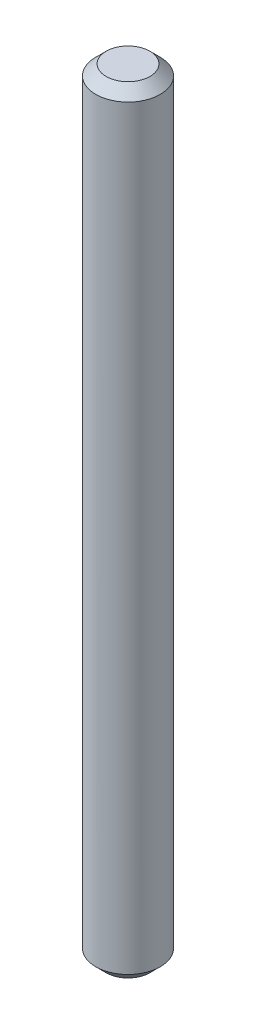
ISO-10303-21;
HEADER;
FILE_DESCRIPTION(('STEP AP214'),'2;1');
FILE_NAME('part.step','',(''),(''),'','','');
FILE_SCHEMA(('AUTOMOTIVE_DESIGN { 1 0 10303 214 1 1 1 1 }'));
ENDSEC;
DATA;
#1=APPLICATION_CONTEXT('core data for automotive mechanical design processes');
#2=APPLICATION_PROTOCOL_DEFINITION('international standard','automotive_design',2000,#1);
#3=PRODUCT_CONTEXT('',#1,'mechanical');
#4=PRODUCT('Part','Part','',(#3));
#5=PRODUCT_RELATED_PRODUCT_CATEGORY('part','',(#4));
#6=PRODUCT_DEFINITION_FORMATION('','',#4);
#7=PRODUCT_DEFINITION_CONTEXT('part definition',#1,'design');
#8=PRODUCT_DEFINITION('design','',#6,#7);
#9=PRODUCT_DEFINITION_SHAPE('','',#8);
#10=(LENGTH_UNIT() NAMED_UNIT(*) SI_UNIT(.MILLI.,.METRE.));
#11=(NAMED_UNIT(*) PLANE_ANGLE_UNIT() SI_UNIT($,.RADIAN.));
#12=(NAMED_UNIT(*) SI_UNIT($,.STERADIAN.) SOLID_ANGLE_UNIT());
#13=UNCERTAINTY_MEASURE_WITH_UNIT(LENGTH_MEASURE(1.E-05),#10,'distance_accuracy_value','');
#14=(GEOMETRIC_REPRESENTATION_CONTEXT(3) GLOBAL_UNCERTAINTY_ASSIGNED_CONTEXT((#13)) GLOBAL_UNIT_ASSIGNED_CONTEXT((#10,
#11,#12)) REPRESENTATION_CONTEXT('',''));
#15=CARTESIAN_POINT('',(0.,0.,0.));
#16=DIRECTION('',(0.,0.,1.));
#17=DIRECTION('',(1.,0.,0.));
#18=AXIS2_PLACEMENT_3D('',#15,#16,#17);
#19=CARTESIAN_POINT('',(0.,19.05,0.));
#20=DIRECTION('',(0.,-1.,0.));
#21=DIRECTION('',(0.,0.,-1.));
#22=AXIS2_PLACEMENT_3D('',#19,#20,#21);
#23=CYLINDRICAL_SURFACE('',#22,1.58242);
#24=CARTESIAN_POINT('',(0.,-18.542,0.));
#25=DIRECTION('',(0.,1.,0.));
#26=DIRECTION('',(0.,0.,1.));
#27=AXIS2_PLACEMENT_3D('',#24,#25,#26);
#28=CIRCLE('',#27,1.58242);
#29=CARTESIAN_POINT('',(0.,-18.542,-1.58242));
#30=VERTEX_POINT('',#29);
#31=EDGE_CURVE('E53',#30,#30,#28,.T.);
#32=CARTESIAN_POINT('',(0.,18.542,0.));
#33=DIRECTION('',(0.,1.,0.));
#34=DIRECTION('',(0.,0.,1.));
#35=AXIS2_PLACEMENT_3D('',#32,#33,#34);
#36=CIRCLE('',#35,1.58242);
#37=CARTESIAN_POINT('',(0.,18.542,-1.58242));
#38=VERTEX_POINT('',#37);
#39=EDGE_CURVE('E57',#38,#38,#36,.F.);
#40=CARTESIAN_POINT('',(0.,-18.542,-1.58242));
#41=CARTESIAN_POINT('',(0.,-18.1557083333333,-1.58242));
#42=CARTESIAN_POINT('',(0.,-17.7694166666666,-1.58242));
#43=CARTESIAN_POINT('',(0.,-16.9968333333333,-1.58242));
#44=CARTESIAN_POINT('',(0.,-16.6105416666666,-1.58242));
#45=CARTESIAN_POINT('',(0.,-15.8379583333333,-1.58242));
#46=CARTESIAN_POINT('',(0.,-15.4516666666666,-1.58242));
#47=CARTESIAN_POINT('',(0.,-14.6790833333333,-1.58242));
#48=CARTESIAN_POINT('',(0.,-14.2927916666666,-1.58242));
#49=CARTESIAN_POINT('',(0.,-13.5202083333333,-1.58242));
#50=CARTESIAN_POINT('',(0.,-13.1339166666666,-1.58242));
#51=CARTESIAN_POINT('',(0.,-12.3613333333333,-1.58242));
#52=CARTESIAN_POINT('',(0.,-11.9750416666666,-1.58242));
#53=CARTESIAN_POINT('',(0.,-11.2024583333333,-1.58242));
#54=CARTESIAN_POINT('',(0.,-10.8161666666666,-1.58242));
#55=CARTESIAN_POINT('',(0.,-10.0435833333333,-1.58242));
#56=CARTESIAN_POINT('',(0.,-9.65729166666664,-1.58242));
#57=CARTESIAN_POINT('',(0.,-8.88470833333331,-1.58242));
#58=CARTESIAN_POINT('',(0.,-8.49841666666664,-1.58242));
#59=CARTESIAN_POINT('',(0.,-7.72583333333331,-1.58242));
#60=CARTESIAN_POINT('',(0.,-7.33954166666664,-1.58242));
#61=CARTESIAN_POINT('',(0.,-6.56695833333331,-1.58242));
#62=CARTESIAN_POINT('',(0.,-6.18066666666664,-1.58242));
#63=CARTESIAN_POINT('',(0.,-5.40808333333331,-1.58242));
#64=CARTESIAN_POINT('',(0.,-5.02179166666664,-1.58242));
#65=CARTESIAN_POINT('',(0.,-4.24920833333331,-1.58242));
#66=CARTESIAN_POINT('',(0.,-3.86291666666664,-1.58242));
#67=CARTESIAN_POINT('',(0.,-3.09033333333331,-1.58242));
#68=CARTESIAN_POINT('',(0.,-2.70404166666665,-1.58242));
#69=CARTESIAN_POINT('',(0.,-1.93145833333331,-1.58242));
#70=CARTESIAN_POINT('',(0.,-1.54516666666665,-1.58242));
#71=CARTESIAN_POINT('',(0.,-0.772583333333313,-1.58242));
#72=CARTESIAN_POINT('',(0.,-0.386291666666646,-1.58242));
#73=CARTESIAN_POINT('',(0.,0.386291666666688,-1.58242));
#74=CARTESIAN_POINT('',(0.,0.772583333333354,-1.58242));
#75=CARTESIAN_POINT('',(0.,1.54516666666669,-1.58242));
#76=CARTESIAN_POINT('',(0.,1.93145833333335,-1.58242));
#77=CARTESIAN_POINT('',(0.,2.70404166666669,-1.58242));
#78=CARTESIAN_POINT('',(0.,3.09033333333335,-1.58242));
#79=CARTESIAN_POINT('',(0.,3.86291666666668,-1.58242));
#80=CARTESIAN_POINT('',(0.,4.24920833333335,-1.58242));
#81=CARTESIAN_POINT('',(0.,5.02179166666668,-1.58242));
#82=CARTESIAN_POINT('',(0.,5.40808333333335,-1.58242));
#83=CARTESIAN_POINT('',(0.,6.18066666666668,-1.58242));
#84=CARTESIAN_POINT('',(0.,6.56695833333335,-1.58242));
#85=CARTESIAN_POINT('',(0.,7.33954166666668,-1.58242));
#86=CARTESIAN_POINT('',(0.,7.72583333333335,-1.58242));
#87=CARTESIAN_POINT('',(0.,8.49841666666668,-1.58242));
#88=CARTESIAN_POINT('',(0.,8.88470833333335,-1.58242));
#89=CARTESIAN_POINT('',(0.,9.65729166666668,-1.58242));
#90=CARTESIAN_POINT('',(0.,10.0435833333333,-1.58242));
#91=CARTESIAN_POINT('',(0.,10.8161666666667,-1.58242));
#92=CARTESIAN_POINT('',(0.,11.2024583333333,-1.58242));
#93=CARTESIAN_POINT('',(0.,11.9750416666667,-1.58242));
#94=CARTESIAN_POINT('',(0.,12.3613333333333,-1.58242));
#95=CARTESIAN_POINT('',(0.,13.1339166666667,-1.58242));
#96=CARTESIAN_POINT('',(0.,13.5202083333333,-1.58242));
#97=CARTESIAN_POINT('',(0.,14.2927916666667,-1.58242));
#98=CARTESIAN_POINT('',(0.,14.6790833333333,-1.58242));
#99=CARTESIAN_POINT('',(0.,15.4516666666667,-1.58242));
#100=CARTESIAN_POINT('',(0.,15.8379583333333,-1.58242));
#101=CARTESIAN_POINT('',(0.,16.6105416666667,-1.58242));
#102=CARTESIAN_POINT('',(0.,16.9968333333333,-1.58242));
#103=CARTESIAN_POINT('',(0.,17.7694166666667,-1.58242));
#104=CARTESIAN_POINT('',(0.,18.1557083333333,-1.58242));
#105=CARTESIAN_POINT('',(0.,18.542,-1.58242));
#106=B_SPLINE_CURVE_WITH_KNOTS('',3,(#40,#41,#42,#43,#44,#45,#46,#47,#48,#49,#50,#51,#52,#53,
#54,#55,#56,#57,#58,#59,#60,#61,#62,#63,#64,#65,#66,#67,#68,#69,#70,#71,#72,#73,#74,#75,#76,#77,
#78,#79,#80,#81,#82,#83,#84,#85,#86,#87,#88,#89,#90,#91,#92,#93,#94,#95,#96,#97,#98,#99,#100,
#101,#102,#103,#104,#105),.UNSPECIFIED.,.F.,.F.,(4,2,2,2,2,2,2,2,2,2,2,2,2,2,2,2,2,2,2,2,2,2,2,
2,2,2,2,2,2,2,2,2,4),(0.,1.158875,2.31775,3.476625,4.6355,5.794375,6.95324999999999,
8.11212499999999,9.27099999999999,10.429875,11.58875,12.747625,13.9065,15.065375,16.22425,
17.383125,18.542,19.700875,20.85975,22.018625,23.1775,24.336375,25.49525,26.654125,27.813,
28.971875,30.13075,31.289625,32.4485,33.607375,34.76625,35.925125,37.084),.UNSPECIFIED.);
#107=EDGE_CURVE('BSEAM41',#30,#38,#106,.T.);
#108=ORIENTED_EDGE('',*,*,#31,.T.);
#109=ORIENTED_EDGE('',*,*,#39,.T.);
#110=ORIENTED_EDGE('',*,*,#107,.T.);
#111=ORIENTED_EDGE('',*,*,#107,.F.);
#112=EDGE_LOOP('',(#108,#110,#109,#111));
#113=FACE_BOUND('',#112,.T.);
#114=ADVANCED_FACE('F41',(#113),#23,.T.);
#115=CARTESIAN_POINT('',(0.,19.05,0.));
#116=DIRECTION('',(0.,1.,0.));
#117=DIRECTION('',(0.,0.,1.));
#118=AXIS2_PLACEMENT_3D('',#115,#116,#117);
#119=PLANE('',#118);
#120=CARTESIAN_POINT('',(0.,19.05,0.));
#121=DIRECTION('',(0.,1.,0.));
#122=DIRECTION('',(0.,0.,1.));
#123=AXIS2_PLACEMENT_3D('',#120,#121,#122);
#124=CIRCLE('',#123,1.07442000000001);
#125=CARTESIAN_POINT('',(0.,19.05,1.07442000000001));
#126=VERTEX_POINT('',#125);
#127=EDGE_CURVE('E10',#126,#126,#124,.T.);
#128=ORIENTED_EDGE('',*,*,#127,.T.);
#129=EDGE_LOOP('',(#128));
#130=FACE_BOUND('',#129,.T.);
#131=ADVANCED_FACE('F73',(#130),#119,.T.);
#132=CARTESIAN_POINT('',(0.,-19.05,0.));
#133=DIRECTION('',(0.,1.,0.));
#134=DIRECTION('',(0.,0.,1.));
#135=AXIS2_PLACEMENT_3D('',#132,#133,#134);
#136=PLANE('',#135);
#137=CARTESIAN_POINT('',(0.,-19.05,0.));
#138=DIRECTION('',(0.,1.,0.));
#139=DIRECTION('',(0.,0.,1.));
#140=AXIS2_PLACEMENT_3D('',#137,#138,#139);
#141=CIRCLE('',#140,1.07441999999995);
#142=CARTESIAN_POINT('',(0.,-19.05,1.07441999999995));
#143=VERTEX_POINT('',#142);
#144=EDGE_CURVE('E49',#143,#143,#141,.F.);
#145=ORIENTED_EDGE('',*,*,#144,.T.);
#146=EDGE_LOOP('',(#145));
#147=FACE_BOUND('',#146,.T.);
#148=ADVANCED_FACE('F70',(#147),#136,.F.);
#149=CARTESIAN_POINT('',(0.,-18.542,0.));
#150=DIRECTION('',(0.,1.,0.));
#151=DIRECTION('',(0.,0.,1.));
#152=AXIS2_PLACEMENT_3D('',#149,#150,#151);
#153=CONICAL_SURFACE('',#152,1.58242,0.785398163397458);
#154=ORIENTED_EDGE('',*,*,#144,.F.);
#155=EDGE_LOOP('',(#154));
#156=FACE_BOUND('',#155,.T.);
#157=ORIENTED_EDGE('',*,*,#31,.F.);
#158=EDGE_LOOP('',(#157));
#159=FACE_BOUND('',#158,.T.);
#160=ADVANCED_FACE('F66',(#156,#159),#153,.T.);
#161=CARTESIAN_POINT('',(0.,19.05,0.));
#162=DIRECTION('',(0.,-1.,0.));
#163=DIRECTION('',(0.,0.,-1.));
#164=AXIS2_PLACEMENT_3D('',#161,#162,#163);
#165=CONICAL_SURFACE('',#164,1.07442000000001,0.785398163397448);
#166=ORIENTED_EDGE('',*,*,#39,.F.);
#167=EDGE_LOOP('',(#166));
#168=FACE_BOUND('',#167,.T.);
#169=ORIENTED_EDGE('',*,*,#127,.F.);
#170=EDGE_LOOP('',(#169));
#171=FACE_BOUND('',#170,.T.);
#172=ADVANCED_FACE('F44',(#168,#171),#165,.T.);
#173=CLOSED_SHELL('',(#114,#131,#148,#160,#172));
#174=MANIFOLD_SOLID_BREP('B2',#173);
#175=ADVANCED_BREP_SHAPE_REPRESENTATION('',(#18,#174),#14);
#176=SHAPE_DEFINITION_REPRESENTATION(#9,#175);
ENDSEC;
END-ISO-10303-21;
